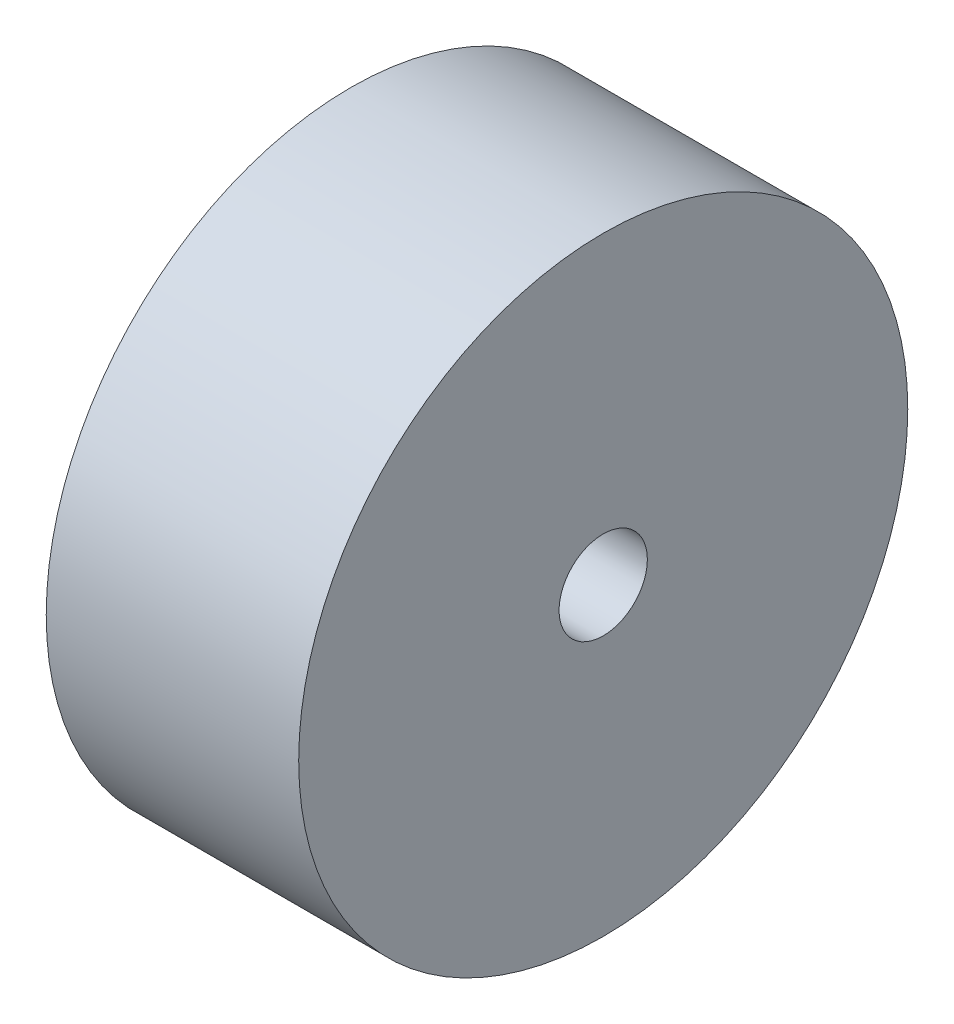
ISO-10303-21;
HEADER;
FILE_DESCRIPTION(('STEP AP214'),'2;1');
FILE_NAME('part.step','',(''),(''),'','','');
FILE_SCHEMA(('AUTOMOTIVE_DESIGN { 1 0 10303 214 1 1 1 1 }'));
ENDSEC;
DATA;
#1=APPLICATION_CONTEXT('core data for automotive mechanical design processes');
#2=APPLICATION_PROTOCOL_DEFINITION('international standard','automotive_design',2000,#1);
#3=PRODUCT_CONTEXT('',#1,'mechanical');
#4=PRODUCT('Part','Part','',(#3));
#5=PRODUCT_RELATED_PRODUCT_CATEGORY('part','',(#4));
#6=PRODUCT_DEFINITION_FORMATION('','',#4);
#7=PRODUCT_DEFINITION_CONTEXT('part definition',#1,'design');
#8=PRODUCT_DEFINITION('design','',#6,#7);
#9=PRODUCT_DEFINITION_SHAPE('','',#8);
#10=(LENGTH_UNIT() NAMED_UNIT(*) SI_UNIT(.MILLI.,.METRE.));
#11=(NAMED_UNIT(*) PLANE_ANGLE_UNIT() SI_UNIT($,.RADIAN.));
#12=(NAMED_UNIT(*) SI_UNIT($,.STERADIAN.) SOLID_ANGLE_UNIT());
#13=UNCERTAINTY_MEASURE_WITH_UNIT(LENGTH_MEASURE(1.E-05),#10,'distance_accuracy_value','');
#14=(GEOMETRIC_REPRESENTATION_CONTEXT(3) GLOBAL_UNCERTAINTY_ASSIGNED_CONTEXT((#13)) GLOBAL_UNIT_ASSIGNED_CONTEXT((#10,
#11,#12)) REPRESENTATION_CONTEXT('',''));
#15=CARTESIAN_POINT('',(0.,0.,0.));
#16=DIRECTION('',(0.,0.,1.));
#17=DIRECTION('',(1.,0.,0.));
#18=AXIS2_PLACEMENT_3D('',#15,#16,#17);
#19=CARTESIAN_POINT('',(14.3,0.,0.));
#20=DIRECTION('',(-1.,0.,0.));
#21=DIRECTION('',(0.,0.,1.));
#22=AXIS2_PLACEMENT_3D('',#19,#20,#21);
#23=CYLINDRICAL_SURFACE('',#22,17.25);
#24=CARTESIAN_POINT('',(14.3,0.,0.));
#25=DIRECTION('',(1.,0.,0.));
#26=DIRECTION('',(0.,0.,-1.));
#27=AXIS2_PLACEMENT_3D('',#24,#25,#26);
#28=CIRCLE('',#27,17.25);
#29=CARTESIAN_POINT('',(14.3,0.,-17.25));
#30=VERTEX_POINT('',#29);
#31=EDGE_CURVE('E10',#30,#30,#28,.T.);
#32=ORIENTED_EDGE('',*,*,#31,.F.);
#33=EDGE_LOOP('',(#32));
#34=FACE_BOUND('',#33,.T.);
#35=CARTESIAN_POINT('',(0.,0.,0.));
#36=DIRECTION('',(1.,0.,0.));
#37=DIRECTION('',(0.,0.,-1.));
#38=AXIS2_PLACEMENT_3D('',#35,#36,#37);
#39=CIRCLE('',#38,17.25);
#40=CARTESIAN_POINT('',(0.,0.,-17.25));
#41=VERTEX_POINT('',#40);
#42=EDGE_CURVE('E33',#41,#41,#39,.T.);
#43=ORIENTED_EDGE('',*,*,#42,.T.);
#44=EDGE_LOOP('',(#43));
#45=FACE_BOUND('',#44,.T.);
#46=ADVANCED_FACE('F30',(#34,#45),#23,.T.);
#47=CARTESIAN_POINT('',(14.3,0.,0.));
#48=DIRECTION('',(1.,0.,0.));
#49=DIRECTION('',(0.,0.,-1.));
#50=AXIS2_PLACEMENT_3D('',#47,#48,#49);
#51=PLANE('',#50);
#52=CARTESIAN_POINT('',(14.3,0.,0.));
#53=DIRECTION('',(1.,0.,0.));
#54=DIRECTION('',(0.,0.,-1.));
#55=AXIS2_PLACEMENT_3D('',#52,#53,#54);
#56=CIRCLE('',#55,2.5);
#57=CARTESIAN_POINT('',(14.3,0.,-2.5));
#58=VERTEX_POINT('',#57);
#59=EDGE_CURVE('E40',#58,#58,#56,.T.);
#60=ORIENTED_EDGE('',*,*,#59,.F.);
#61=EDGE_LOOP('',(#60));
#62=FACE_BOUND('',#61,.T.);
#63=ORIENTED_EDGE('',*,*,#31,.T.);
#64=EDGE_LOOP('',(#63));
#65=FACE_BOUND('',#64,.T.);
#66=ADVANCED_FACE('F58',(#62,#65),#51,.T.);
#67=CARTESIAN_POINT('',(0.,0.,0.));
#68=DIRECTION('',(1.,0.,0.));
#69=DIRECTION('',(0.,0.,-1.));
#70=AXIS2_PLACEMENT_3D('',#67,#68,#69);
#71=PLANE('',#70);
#72=CARTESIAN_POINT('',(0.,0.,0.));
#73=DIRECTION('',(1.,0.,0.));
#74=DIRECTION('',(0.,0.,-1.));
#75=AXIS2_PLACEMENT_3D('',#72,#73,#74);
#76=CIRCLE('',#75,2.5);
#77=CARTESIAN_POINT('',(0.,0.,-2.5));
#78=VERTEX_POINT('',#77);
#79=EDGE_CURVE('E44',#78,#78,#76,.T.);
#80=ORIENTED_EDGE('',*,*,#79,.T.);
#81=EDGE_LOOP('',(#80));
#82=FACE_BOUND('',#81,.T.);
#83=ORIENTED_EDGE('',*,*,#42,.F.);
#84=EDGE_LOOP('',(#83));
#85=FACE_BOUND('',#84,.T.);
#86=ADVANCED_FACE('F48',(#82,#85),#71,.F.);
#87=CARTESIAN_POINT('',(0.,0.,0.));
#88=DIRECTION('',(1.,0.,0.));
#89=DIRECTION('',(0.,0.,-1.));
#90=AXIS2_PLACEMENT_3D('',#87,#88,#89);
#91=CYLINDRICAL_SURFACE('',#90,2.5);
#92=ORIENTED_EDGE('',*,*,#59,.T.);
#93=EDGE_LOOP('',(#92));
#94=FACE_BOUND('',#93,.T.);
#95=ORIENTED_EDGE('',*,*,#79,.F.);
#96=EDGE_LOOP('',(#95));
#97=FACE_BOUND('',#96,.T.);
#98=ADVANCED_FACE('F51',(#94,#97),#91,.F.);
#99=CLOSED_SHELL('',(#46,#66,#86,#98));
#100=MANIFOLD_SOLID_BREP('B2',#99);
#101=ADVANCED_BREP_SHAPE_REPRESENTATION('',(#18,#100),#14);
#102=SHAPE_DEFINITION_REPRESENTATION(#9,#101);
ENDSEC;
END-ISO-10303-21;
